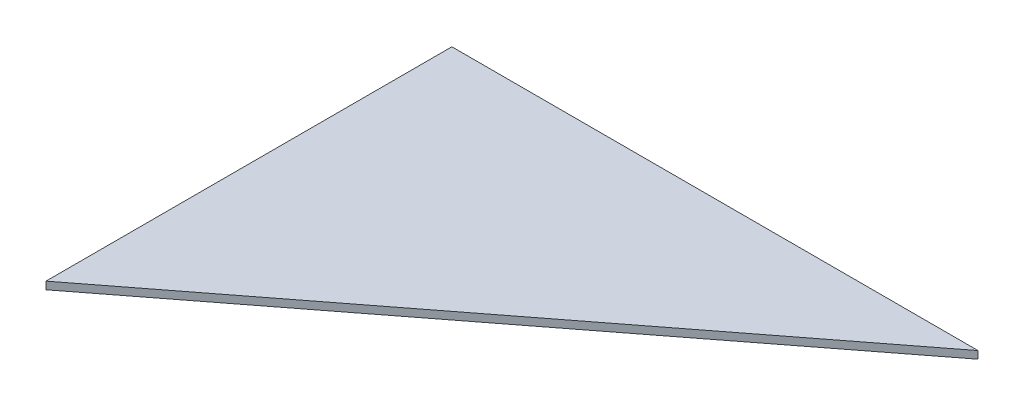
ISO-10303-21;
HEADER;
FILE_DESCRIPTION(('STEP AP214'),'2;1');
FILE_NAME('part.step','',(''),(''),'','','');
FILE_SCHEMA(('AUTOMOTIVE_DESIGN { 1 0 10303 214 1 1 1 1 }'));
ENDSEC;
DATA;
#1=APPLICATION_CONTEXT('core data for automotive mechanical design processes');
#2=APPLICATION_PROTOCOL_DEFINITION('international standard','automotive_design',2000,#1);
#3=PRODUCT_CONTEXT('',#1,'mechanical');
#4=PRODUCT('Part','Part','',(#3));
#5=PRODUCT_RELATED_PRODUCT_CATEGORY('part','',(#4));
#6=PRODUCT_DEFINITION_FORMATION('','',#4);
#7=PRODUCT_DEFINITION_CONTEXT('part definition',#1,'design');
#8=PRODUCT_DEFINITION('design','',#6,#7);
#9=PRODUCT_DEFINITION_SHAPE('','',#8);
#10=(LENGTH_UNIT() NAMED_UNIT(*) SI_UNIT(.MILLI.,.METRE.));
#11=(NAMED_UNIT(*) PLANE_ANGLE_UNIT() SI_UNIT($,.RADIAN.));
#12=(NAMED_UNIT(*) SI_UNIT($,.STERADIAN.) SOLID_ANGLE_UNIT());
#13=UNCERTAINTY_MEASURE_WITH_UNIT(LENGTH_MEASURE(1.E-05),#10,'distance_accuracy_value','');
#14=(GEOMETRIC_REPRESENTATION_CONTEXT(3) GLOBAL_UNCERTAINTY_ASSIGNED_CONTEXT((#13)) GLOBAL_UNIT_ASSIGNED_CONTEXT((#10,
#11,#12)) REPRESENTATION_CONTEXT('',''));
#15=CARTESIAN_POINT('',(0.,0.,0.));
#16=DIRECTION('',(0.,0.,1.));
#17=DIRECTION('',(1.,0.,0.));
#18=AXIS2_PLACEMENT_3D('',#15,#16,#17);
#19=CARTESIAN_POINT('',(349.999999999999,2.5,-270.));
#20=DIRECTION('',(-0.610803454291822,0.,-0.791782255563471));
#21=DIRECTION('',(-0.791782255563471,0.,0.610803454291822));
#22=AXIS2_PLACEMENT_3D('',#19,#20,#21);
#23=PLANE('',#22);
#24=DIRECTION('',(0.791782255563471,0.,-0.610803454291822));
#25=VECTOR('',#24,1.);
#26=CARTESIAN_POINT('',(349.999999999999,-2.5,-270.));
#27=LINE('',#26,#25);
#28=CARTESIAN_POINT('',(0.,-2.5,0.));
#29=VERTEX_POINT('',#28);
#30=CARTESIAN_POINT('',(349.999999999999,-2.5,-270.));
#31=VERTEX_POINT('',#30);
#32=EDGE_CURVE('E84',#29,#31,#27,.T.);
#33=ORIENTED_EDGE('',*,*,#32,.T.);
#34=DIRECTION('',(0.,-1.,0.));
#35=VECTOR('',#34,1.);
#36=CARTESIAN_POINT('',(349.999999999999,2.5,-270.));
#37=LINE('',#36,#35);
#38=CARTESIAN_POINT('',(349.999999999999,2.5,-270.));
#39=VERTEX_POINT('',#38);
#40=EDGE_CURVE('E11',#39,#31,#37,.T.);
#41=ORIENTED_EDGE('',*,*,#40,.F.);
#42=DIRECTION('',(0.791782255563471,0.,-0.610803454291822));
#43=VECTOR('',#42,1.);
#44=CARTESIAN_POINT('',(349.999999999999,2.5,-270.));
#45=LINE('',#44,#43);
#46=CARTESIAN_POINT('',(0.,2.5,0.));
#47=VERTEX_POINT('',#46);
#48=EDGE_CURVE('E77',#47,#39,#45,.T.);
#49=ORIENTED_EDGE('',*,*,#48,.F.);
#50=DIRECTION('',(0.,-1.,0.));
#51=VECTOR('',#50,1.);
#52=CARTESIAN_POINT('',(0.,2.5,0.));
#53=LINE('',#52,#51);
#54=EDGE_CURVE('E85',#47,#29,#53,.T.);
#55=ORIENTED_EDGE('',*,*,#54,.T.);
#56=EDGE_LOOP('',(#33,#41,#49,#55));
#57=FACE_BOUND('',#56,.T.);
#58=ADVANCED_FACE('F37',(#57),#23,.F.);
#59=CARTESIAN_POINT('',(-6.85166209482954E-13,2.5,-270.));
#60=DIRECTION('',(0.,0.,1.));
#61=DIRECTION('',(1.,0.,0.));
#62=AXIS2_PLACEMENT_3D('',#59,#60,#61);
#63=PLANE('',#62);
#64=DIRECTION('',(-1.,0.,0.));
#65=VECTOR('',#64,1.);
#66=CARTESIAN_POINT('',(-6.85166209482954E-13,-2.5,-270.));
#67=LINE('',#66,#65);
#68=CARTESIAN_POINT('',(-6.85166209482954E-13,-2.5,-270.));
#69=VERTEX_POINT('',#68);
#70=EDGE_CURVE('E65',#31,#69,#67,.T.);
#71=ORIENTED_EDGE('',*,*,#70,.T.);
#72=DIRECTION('',(0.,-1.,0.));
#73=VECTOR('',#72,1.);
#74=CARTESIAN_POINT('',(-6.85166209482954E-13,2.5,-270.));
#75=LINE('',#74,#73);
#76=CARTESIAN_POINT('',(-6.85166209482954E-13,2.5,-270.));
#77=VERTEX_POINT('',#76);
#78=EDGE_CURVE('E45',#77,#69,#75,.T.);
#79=ORIENTED_EDGE('',*,*,#78,.F.);
#80=DIRECTION('',(-1.,0.,0.));
#81=VECTOR('',#80,1.);
#82=CARTESIAN_POINT('',(-6.85166209482954E-13,2.5,-270.));
#83=LINE('',#82,#81);
#84=EDGE_CURVE('E73',#39,#77,#83,.T.);
#85=ORIENTED_EDGE('',*,*,#84,.F.);
#86=ORIENTED_EDGE('',*,*,#40,.T.);
#87=EDGE_LOOP('',(#71,#79,#85,#86));
#88=FACE_BOUND('',#87,.T.);
#89=ADVANCED_FACE('F74',(#88),#63,.F.);
#90=CARTESIAN_POINT('',(0.,2.5,0.));
#91=DIRECTION('',(1.,0.,0.));
#92=DIRECTION('',(0.,0.,-1.));
#93=AXIS2_PLACEMENT_3D('',#90,#91,#92);
#94=PLANE('',#93);
#95=DIRECTION('',(0.,0.,1.));
#96=VECTOR('',#95,1.);
#97=CARTESIAN_POINT('',(0.,-2.5,0.));
#98=LINE('',#97,#96);
#99=EDGE_CURVE('E70',#69,#29,#98,.T.);
#100=ORIENTED_EDGE('',*,*,#99,.T.);
#101=ORIENTED_EDGE('',*,*,#54,.F.);
#102=DIRECTION('',(0.,0.,1.));
#103=VECTOR('',#102,1.);
#104=CARTESIAN_POINT('',(0.,2.5,0.));
#105=LINE('',#104,#103);
#106=EDGE_CURVE('E53',#77,#47,#105,.T.);
#107=ORIENTED_EDGE('',*,*,#106,.F.);
#108=ORIENTED_EDGE('',*,*,#78,.T.);
#109=EDGE_LOOP('',(#100,#101,#107,#108));
#110=FACE_BOUND('',#109,.T.);
#111=ADVANCED_FACE('F92',(#110),#94,.F.);
#112=CARTESIAN_POINT('',(0.,2.5,0.));
#113=DIRECTION('',(0.,-1.,0.));
#114=DIRECTION('',(0.,0.,-1.));
#115=AXIS2_PLACEMENT_3D('',#112,#113,#114);
#116=PLANE('',#115);
#117=ORIENTED_EDGE('',*,*,#48,.T.);
#118=ORIENTED_EDGE('',*,*,#84,.T.);
#119=ORIENTED_EDGE('',*,*,#106,.T.);
#120=EDGE_LOOP('',(#117,#118,#119));
#121=FACE_BOUND('',#120,.T.);
#122=ADVANCED_FACE('F80',(#121),#116,.F.);
#123=CARTESIAN_POINT('',(0.,-2.5,0.));
#124=DIRECTION('',(0.,-1.,0.));
#125=DIRECTION('',(0.,0.,-1.));
#126=AXIS2_PLACEMENT_3D('',#123,#124,#125);
#127=PLANE('',#126);
#128=ORIENTED_EDGE('',*,*,#32,.F.);
#129=ORIENTED_EDGE('',*,*,#99,.F.);
#130=ORIENTED_EDGE('',*,*,#70,.F.);
#131=EDGE_LOOP('',(#128,#129,#130));
#132=FACE_BOUND('',#131,.T.);
#133=ADVANCED_FACE('F93',(#132),#127,.T.);
#134=CLOSED_SHELL('',(#58,#89,#111,#122,#133));
#135=MANIFOLD_SOLID_BREP('B2',#134);
#136=ADVANCED_BREP_SHAPE_REPRESENTATION('',(#18,#135),#14);
#137=SHAPE_DEFINITION_REPRESENTATION(#9,#136);
ENDSEC;
END-ISO-10303-21;
